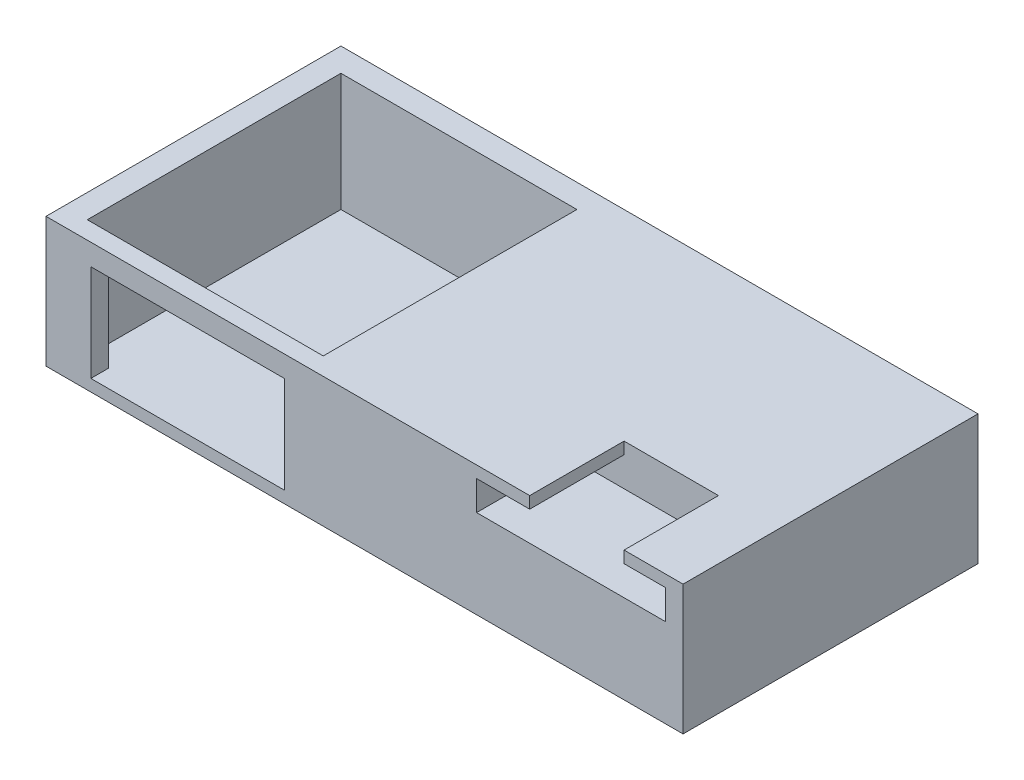
ISO-10303-21;
HEADER;
FILE_DESCRIPTION(('STEP AP214'),'2;1');
FILE_NAME('part.step','',(''),(''),'','','');
FILE_SCHEMA(('AUTOMOTIVE_DESIGN { 1 0 10303 214 1 1 1 1 }'));
ENDSEC;
DATA;
#1=APPLICATION_CONTEXT('core data for automotive mechanical design processes');
#2=APPLICATION_PROTOCOL_DEFINITION('international standard','automotive_design',2000,#1);
#3=PRODUCT_CONTEXT('',#1,'mechanical');
#4=PRODUCT('Part','Part','',(#3));
#5=PRODUCT_RELATED_PRODUCT_CATEGORY('part','',(#4));
#6=PRODUCT_DEFINITION_FORMATION('','',#4);
#7=PRODUCT_DEFINITION_CONTEXT('part definition',#1,'design');
#8=PRODUCT_DEFINITION('design','',#6,#7);
#9=PRODUCT_DEFINITION_SHAPE('','',#8);
#10=(LENGTH_UNIT() NAMED_UNIT(*) SI_UNIT(.MILLI.,.METRE.));
#11=(NAMED_UNIT(*) PLANE_ANGLE_UNIT() SI_UNIT($,.RADIAN.));
#12=(NAMED_UNIT(*) SI_UNIT($,.STERADIAN.) SOLID_ANGLE_UNIT());
#13=UNCERTAINTY_MEASURE_WITH_UNIT(LENGTH_MEASURE(1.E-05),#10,'distance_accuracy_value','');
#14=(GEOMETRIC_REPRESENTATION_CONTEXT(3) GLOBAL_UNCERTAINTY_ASSIGNED_CONTEXT((#13)) GLOBAL_UNIT_ASSIGNED_CONTEXT((#10,
#11,#12)) REPRESENTATION_CONTEXT('',''));
#15=CARTESIAN_POINT('',(0.,0.,0.));
#16=DIRECTION('',(0.,0.,1.));
#17=DIRECTION('',(1.,0.,0.));
#18=AXIS2_PLACEMENT_3D('',#15,#16,#17);
#19=CARTESIAN_POINT('',(22.,7.5,-0.500000000000002));
#20=DIRECTION('',(1.,0.,0.));
#21=DIRECTION('',(0.,0.,-1.));
#22=AXIS2_PLACEMENT_3D('',#19,#20,#21);
#23=PLANE('',#22);
#24=DIRECTION('',(0.,0.,-1.));
#25=VECTOR('',#24,1.);
#26=CARTESIAN_POINT('',(22.,10.,-0.500000000000002));
#27=LINE('',#26,#25);
#28=CARTESIAN_POINT('',(22.,10.,-0.5));
#29=VERTEX_POINT('',#28);
#30=CARTESIAN_POINT('',(21.9999999999999,10.,-8.5));
#31=VERTEX_POINT('',#30);
#32=EDGE_CURVE('E176',#29,#31,#27,.T.);
#33=ORIENTED_EDGE('',*,*,#32,.F.);
#34=DIRECTION('',(0.,1.,0.));
#35=VECTOR('',#34,1.);
#36=CARTESIAN_POINT('',(22.,7.5,-0.500000000000002));
#37=LINE('',#36,#35);
#38=CARTESIAN_POINT('',(22.,11.,-0.500000000000002));
#39=VERTEX_POINT('',#38);
#40=EDGE_CURVE('E250',#29,#39,#37,.T.);
#41=ORIENTED_EDGE('',*,*,#40,.T.);
#42=DIRECTION('',(0.,0.,-1.));
#43=VECTOR('',#42,1.);
#44=CARTESIAN_POINT('',(22.,11.,-0.500000000000002));
#45=LINE('',#44,#43);
#46=CARTESIAN_POINT('',(21.9999999999999,11.,-8.5));
#47=VERTEX_POINT('',#46);
#48=EDGE_CURVE('E224',#39,#47,#45,.T.);
#49=ORIENTED_EDGE('',*,*,#48,.T.);
#50=DIRECTION('',(0.,1.,0.));
#51=VECTOR('',#50,1.);
#52=CARTESIAN_POINT('',(21.9999999999999,7.5,-8.5));
#53=LINE('',#52,#51);
#54=EDGE_CURVE('E242',#31,#47,#53,.T.);
#55=ORIENTED_EDGE('',*,*,#54,.F.);
#56=EDGE_LOOP('',(#33,#41,#49,#55));
#57=FACE_BOUND('',#56,.T.);
#58=ADVANCED_FACE('F36',(#57),#23,.F.);
#59=CARTESIAN_POINT('',(13.9999999999999,7.5,-8.5));
#60=DIRECTION('',(-1.,0.,0.));
#61=DIRECTION('',(0.,0.,1.));
#62=AXIS2_PLACEMENT_3D('',#59,#60,#61);
#63=PLANE('',#62);
#64=DIRECTION('',(0.,0.,1.));
#65=VECTOR('',#64,1.);
#66=CARTESIAN_POINT('',(13.9999999999999,10.,-8.5));
#67=LINE('',#66,#65);
#68=CARTESIAN_POINT('',(13.9999999999999,10.,-8.49999999999999));
#69=VERTEX_POINT('',#68);
#70=CARTESIAN_POINT('',(13.9999999999999,10.,-0.5));
#71=VERTEX_POINT('',#70);
#72=EDGE_CURVE('E195',#69,#71,#67,.T.);
#73=ORIENTED_EDGE('',*,*,#72,.F.);
#74=DIRECTION('',(0.,1.,0.));
#75=VECTOR('',#74,1.);
#76=CARTESIAN_POINT('',(13.9999999999999,7.5,-8.5));
#77=LINE('',#76,#75);
#78=CARTESIAN_POINT('',(13.9999999999999,11.,-8.5));
#79=VERTEX_POINT('',#78);
#80=EDGE_CURVE('E255',#69,#79,#77,.T.);
#81=ORIENTED_EDGE('',*,*,#80,.T.);
#82=DIRECTION('',(0.,0.,1.));
#83=VECTOR('',#82,1.);
#84=CARTESIAN_POINT('',(13.9999999999999,11.,-8.5));
#85=LINE('',#84,#83);
#86=CARTESIAN_POINT('',(13.9999999999999,11.,-0.5));
#87=VERTEX_POINT('',#86);
#88=EDGE_CURVE('E240',#79,#87,#85,.T.);
#89=ORIENTED_EDGE('',*,*,#88,.T.);
#90=DIRECTION('',(0.,1.,0.));
#91=VECTOR('',#90,1.);
#92=CARTESIAN_POINT('',(13.9999999999999,7.5,-0.5));
#93=LINE('',#92,#91);
#94=EDGE_CURVE('E253',#71,#87,#93,.T.);
#95=ORIENTED_EDGE('',*,*,#94,.F.);
#96=EDGE_LOOP('',(#73,#81,#89,#95));
#97=FACE_BOUND('',#96,.T.);
#98=ADVANCED_FACE('F348',(#97),#63,.F.);
#99=CARTESIAN_POINT('',(-27.,11.,-0.5));
#100=DIRECTION('',(0.,0.,-1.));
#101=DIRECTION('',(-1.,0.,0.));
#102=AXIS2_PLACEMENT_3D('',#99,#100,#101);
#103=PLANE('',#102);
#104=DIRECTION('',(1.,0.,0.));
#105=VECTOR('',#104,1.);
#106=CARTESIAN_POINT('',(13.9999999999999,7.5,-0.5));
#107=LINE('',#106,#105);
#108=CARTESIAN_POINT('',(9.49999999999995,7.5,-0.5));
#109=VERTEX_POINT('',#108);
#110=CARTESIAN_POINT('',(25.4999999999999,7.5,-0.5));
#111=VERTEX_POINT('',#110);
#112=EDGE_CURVE('E239',#109,#111,#107,.T.);
#113=ORIENTED_EDGE('',*,*,#112,.F.);
#114=DIRECTION('',(0.,-1.,0.));
#115=VECTOR('',#114,1.);
#116=CARTESIAN_POINT('',(9.49999999999995,10.,-0.5));
#117=LINE('',#116,#115);
#118=CARTESIAN_POINT('',(9.49999999999995,10.,-0.5));
#119=VERTEX_POINT('',#118);
#120=EDGE_CURVE('E179',#119,#109,#117,.T.);
#121=ORIENTED_EDGE('',*,*,#120,.F.);
#122=DIRECTION('',(1.,0.,0.));
#123=VECTOR('',#122,1.);
#124=CARTESIAN_POINT('',(9.49999999999995,10.,-0.5));
#125=LINE('',#124,#123);
#126=EDGE_CURVE('E189',#119,#71,#125,.T.);
#127=ORIENTED_EDGE('',*,*,#126,.T.);
#128=ORIENTED_EDGE('',*,*,#94,.T.);
#129=DIRECTION('',(1.,0.,0.));
#130=VECTOR('',#129,1.);
#131=CARTESIAN_POINT('',(-27.,11.,-0.5));
#132=LINE('',#131,#130);
#133=CARTESIAN_POINT('',(-27.,11.,-0.5));
#134=VERTEX_POINT('',#133);
#135=EDGE_CURVE('E298',#134,#87,#132,.T.);
#136=ORIENTED_EDGE('',*,*,#135,.F.);
#137=DIRECTION('',(0.,-1.,0.));
#138=VECTOR('',#137,1.);
#139=CARTESIAN_POINT('',(-27.,11.,-0.5));
#140=LINE('',#139,#138);
#141=CARTESIAN_POINT('',(-27.,0.,-0.5));
#142=VERTEX_POINT('',#141);
#143=EDGE_CURVE('E44',#134,#142,#140,.T.);
#144=ORIENTED_EDGE('',*,*,#143,.T.);
#145=DIRECTION('',(1.,0.,0.));
#146=VECTOR('',#145,1.);
#147=CARTESIAN_POINT('',(-27.,0.,-0.5));
#148=LINE('',#147,#146);
#149=CARTESIAN_POINT('',(27.,0.,-0.5));
#150=VERTEX_POINT('',#149);
#151=EDGE_CURVE('E308',#142,#150,#148,.T.);
#152=ORIENTED_EDGE('',*,*,#151,.T.);
#153=DIRECTION('',(0.,-1.,0.));
#154=VECTOR('',#153,1.);
#155=CARTESIAN_POINT('',(27.,11.,-0.5));
#156=LINE('',#155,#154);
#157=CARTESIAN_POINT('',(27.,11.,-0.5));
#158=VERTEX_POINT('',#157);
#159=EDGE_CURVE('E313',#158,#150,#156,.T.);
#160=ORIENTED_EDGE('',*,*,#159,.F.);
#161=EDGE_CURVE('E297',#39,#158,#132,.T.);
#162=ORIENTED_EDGE('',*,*,#161,.F.);
#163=ORIENTED_EDGE('',*,*,#40,.F.);
#164=CARTESIAN_POINT('',(25.4999999999999,10.,-0.5));
#165=VERTEX_POINT('',#164);
#166=EDGE_CURVE('E205',#29,#165,#125,.T.);
#167=ORIENTED_EDGE('',*,*,#166,.T.);
#168=DIRECTION('',(0.,-1.,0.));
#169=VECTOR('',#168,1.);
#170=CARTESIAN_POINT('',(25.4999999999999,10.,-0.5));
#171=LINE('',#170,#169);
#172=EDGE_CURVE('E187',#165,#111,#171,.T.);
#173=ORIENTED_EDGE('',*,*,#172,.T.);
#174=EDGE_LOOP('',(#113,#121,#127,#128,#136,#144,#152,#160,#162,#163,#167,#173));
#175=FACE_BOUND('',#174,.T.);
#176=DIRECTION('',(0.,1.,0.));
#177=VECTOR('',#176,1.);
#178=CARTESIAN_POINT('',(-23.2,0.,-0.5));
#179=LINE('',#178,#177);
#180=CARTESIAN_POINT('',(-23.2,0.999999999999999,-0.5));
#181=VERTEX_POINT('',#180);
#182=CARTESIAN_POINT('',(-23.2,9.2,-0.5));
#183=VERTEX_POINT('',#182);
#184=EDGE_CURVE('E59',#181,#183,#179,.T.);
#185=ORIENTED_EDGE('',*,*,#184,.T.);
#186=DIRECTION('',(1.,0.,0.));
#187=VECTOR('',#186,1.);
#188=CARTESIAN_POINT('',(0.,9.2,-0.5));
#189=LINE('',#188,#187);
#190=CARTESIAN_POINT('',(-6.80000000000005,9.2,-0.5));
#191=VERTEX_POINT('',#190);
#192=EDGE_CURVE('E211',#183,#191,#189,.T.);
#193=ORIENTED_EDGE('',*,*,#192,.T.);
#194=DIRECTION('',(0.,-1.,0.));
#195=VECTOR('',#194,1.);
#196=CARTESIAN_POINT('',(-6.80000000000004,0.,-0.5));
#197=LINE('',#196,#195);
#198=CARTESIAN_POINT('',(-6.80000000000005,0.999999999999999,-0.5));
#199=VERTEX_POINT('',#198);
#200=EDGE_CURVE('E216',#191,#199,#197,.T.);
#201=ORIENTED_EDGE('',*,*,#200,.T.);
#202=DIRECTION('',(-1.,0.,0.));
#203=VECTOR('',#202,1.);
#204=CARTESIAN_POINT('',(0.,0.999999999999999,-0.5));
#205=LINE('',#204,#203);
#206=EDGE_CURVE('E221',#199,#181,#205,.T.);
#207=ORIENTED_EDGE('',*,*,#206,.T.);
#208=EDGE_LOOP('',(#185,#193,#201,#207));
#209=FACE_BOUND('',#208,.T.);
#210=ADVANCED_FACE('F320',(#175,#209),#103,.F.);
#211=CARTESIAN_POINT('',(0.,0.999999999999999,-2.00000000000003));
#212=DIRECTION('',(0.,0.,1.));
#213=DIRECTION('',(1.,0.,0.));
#214=AXIS2_PLACEMENT_3D('',#211,#212,#213);
#215=PLANE('',#214);
#216=DIRECTION('',(0.,-1.,0.));
#217=VECTOR('',#216,1.);
#218=CARTESIAN_POINT('',(-23.2,0.,-2.00000000000003));
#219=LINE('',#218,#217);
#220=CARTESIAN_POINT('',(-23.2,9.2,-2.00000000000003));
#221=VERTEX_POINT('',#220);
#222=CARTESIAN_POINT('',(-23.2,0.999999999999999,-2.00000000000003));
#223=VERTEX_POINT('',#222);
#224=EDGE_CURVE('E210',#221,#223,#219,.T.);
#225=ORIENTED_EDGE('',*,*,#224,.T.);
#226=DIRECTION('',(1.,0.,0.));
#227=VECTOR('',#226,1.);
#228=CARTESIAN_POINT('',(0.,0.999999999999999,-2.00000000000003));
#229=LINE('',#228,#227);
#230=CARTESIAN_POINT('',(-25.,0.999999999999999,-2.00000000000003));
#231=VERTEX_POINT('',#230);
#232=EDGE_CURVE('E268',#231,#223,#229,.T.);
#233=ORIENTED_EDGE('',*,*,#232,.F.);
#234=DIRECTION('',(0.,1.,0.));
#235=VECTOR('',#234,1.);
#236=CARTESIAN_POINT('',(-25.,0.999999999999999,-2.00000000000003));
#237=LINE('',#236,#235);
#238=CARTESIAN_POINT('',(-25.,11.,-2.00000000000003));
#239=VERTEX_POINT('',#238);
#240=EDGE_CURVE('E285',#231,#239,#237,.T.);
#241=ORIENTED_EDGE('',*,*,#240,.T.);
#242=DIRECTION('',(1.,0.,0.));
#243=VECTOR('',#242,1.);
#244=CARTESIAN_POINT('',(0.,11.,-2.00000000000003));
#245=LINE('',#244,#243);
#246=CARTESIAN_POINT('',(-5.00000000000005,11.,-2.00000000000003));
#247=VERTEX_POINT('',#246);
#248=EDGE_CURVE('E262',#239,#247,#245,.T.);
#249=ORIENTED_EDGE('',*,*,#248,.T.);
#250=DIRECTION('',(0.,1.,0.));
#251=VECTOR('',#250,1.);
#252=CARTESIAN_POINT('',(-5.00000000000005,0.999999999999999,-2.00000000000003));
#253=LINE('',#252,#251);
#254=CARTESIAN_POINT('',(-5.00000000000005,0.999999999999999,-2.00000000000003));
#255=VERTEX_POINT('',#254);
#256=EDGE_CURVE('E282',#255,#247,#253,.T.);
#257=ORIENTED_EDGE('',*,*,#256,.F.);
#258=CARTESIAN_POINT('',(-6.80000000000005,0.999999999999999,-2.00000000000003));
#259=VERTEX_POINT('',#258);
#260=EDGE_CURVE('E267',#259,#255,#229,.T.);
#261=ORIENTED_EDGE('',*,*,#260,.F.);
#262=DIRECTION('',(0.,1.,0.));
#263=VECTOR('',#262,1.);
#264=CARTESIAN_POINT('',(-6.80000000000004,0.,-2.00000000000003));
#265=LINE('',#264,#263);
#266=CARTESIAN_POINT('',(-6.80000000000005,9.2,-2.00000000000003));
#267=VERTEX_POINT('',#266);
#268=EDGE_CURVE('E214',#259,#267,#265,.T.);
#269=ORIENTED_EDGE('',*,*,#268,.T.);
#270=DIRECTION('',(-1.,0.,0.));
#271=VECTOR('',#270,1.);
#272=CARTESIAN_POINT('',(0.,9.2,-2.00000000000003));
#273=LINE('',#272,#271);
#274=EDGE_CURVE('E226',#267,#221,#273,.T.);
#275=ORIENTED_EDGE('',*,*,#274,.T.);
#276=EDGE_LOOP('',(#225,#233,#241,#249,#257,#261,#269,#275));
#277=FACE_BOUND('',#276,.T.);
#278=ADVANCED_FACE('F388',(#277),#215,.F.);
#279=CARTESIAN_POINT('',(0.,11.,0.));
#280=DIRECTION('',(0.,1.,0.));
#281=DIRECTION('',(0.,0.,1.));
#282=AXIS2_PLACEMENT_3D('',#279,#280,#281);
#283=PLANE('',#282);
#284=ORIENTED_EDGE('',*,*,#48,.F.);
#285=ORIENTED_EDGE('',*,*,#161,.T.);
#286=DIRECTION('',(0.,0.,-1.));
#287=VECTOR('',#286,1.);
#288=CARTESIAN_POINT('',(27.,11.,-0.5));
#289=LINE('',#288,#287);
#290=CARTESIAN_POINT('',(27.,11.,-25.5));
#291=VERTEX_POINT('',#290);
#292=EDGE_CURVE('E301',#158,#291,#289,.T.);
#293=ORIENTED_EDGE('',*,*,#292,.T.);
#294=DIRECTION('',(-1.,0.,0.));
#295=VECTOR('',#294,1.);
#296=CARTESIAN_POINT('',(27.,11.,-25.5));
#297=LINE('',#296,#295);
#298=CARTESIAN_POINT('',(-27.,11.,-25.5));
#299=VERTEX_POINT('',#298);
#300=EDGE_CURVE('E291',#291,#299,#297,.T.);
#301=ORIENTED_EDGE('',*,*,#300,.T.);
#302=DIRECTION('',(0.,0.,1.));
#303=VECTOR('',#302,1.);
#304=CARTESIAN_POINT('',(-27.,11.,-25.5));
#305=LINE('',#304,#303);
#306=EDGE_CURVE('E294',#299,#134,#305,.T.);
#307=ORIENTED_EDGE('',*,*,#306,.T.);
#308=ORIENTED_EDGE('',*,*,#135,.T.);
#309=ORIENTED_EDGE('',*,*,#88,.F.);
#310=DIRECTION('',(-1.,0.,0.));
#311=VECTOR('',#310,1.);
#312=CARTESIAN_POINT('',(21.9999999999999,11.,-8.5));
#313=LINE('',#312,#311);
#314=EDGE_CURVE('E245',#47,#79,#313,.T.);
#315=ORIENTED_EDGE('',*,*,#314,.F.);
#316=EDGE_LOOP('',(#284,#285,#293,#301,#307,#308,#309,#315));
#317=FACE_BOUND('',#316,.T.);
#318=DIRECTION('',(1.,0.,0.));
#319=VECTOR('',#318,1.);
#320=CARTESIAN_POINT('',(0.,11.,-23.5));
#321=LINE('',#320,#319);
#322=CARTESIAN_POINT('',(-25.,11.,-23.5));
#323=VERTEX_POINT('',#322);
#324=CARTESIAN_POINT('',(-5.00000000000005,11.,-23.5));
#325=VERTEX_POINT('',#324);
#326=EDGE_CURVE('E274',#323,#325,#321,.T.);
#327=ORIENTED_EDGE('',*,*,#326,.T.);
#328=DIRECTION('',(0.,0.,1.));
#329=VECTOR('',#328,1.);
#330=CARTESIAN_POINT('',(-5.00000000000005,11.,0.));
#331=LINE('',#330,#329);
#332=EDGE_CURVE('E252',#325,#247,#331,.T.);
#333=ORIENTED_EDGE('',*,*,#332,.T.);
#334=ORIENTED_EDGE('',*,*,#248,.F.);
#335=DIRECTION('',(0.,0.,1.));
#336=VECTOR('',#335,1.);
#337=CARTESIAN_POINT('',(-25.,11.,0.));
#338=LINE('',#337,#336);
#339=EDGE_CURVE('E277',#323,#239,#338,.T.);
#340=ORIENTED_EDGE('',*,*,#339,.F.);
#341=EDGE_LOOP('',(#327,#333,#334,#340));
#342=FACE_BOUND('',#341,.T.);
#343=ADVANCED_FACE('F337',(#317,#342),#283,.T.);
#344=CARTESIAN_POINT('',(27.,11.,-25.5));
#345=DIRECTION('',(0.,0.,1.));
#346=DIRECTION('',(1.,0.,0.));
#347=AXIS2_PLACEMENT_3D('',#344,#345,#346);
#348=PLANE('',#347);
#349=DIRECTION('',(-1.,0.,0.));
#350=VECTOR('',#349,1.);
#351=CARTESIAN_POINT('',(27.,0.,-25.5));
#352=LINE('',#351,#350);
#353=CARTESIAN_POINT('',(27.,0.,-25.5));
#354=VERTEX_POINT('',#353);
#355=CARTESIAN_POINT('',(-27.,0.,-25.5));
#356=VERTEX_POINT('',#355);
#357=EDGE_CURVE('E284',#354,#356,#352,.T.);
#358=ORIENTED_EDGE('',*,*,#357,.T.);
#359=DIRECTION('',(0.,-1.,0.));
#360=VECTOR('',#359,1.);
#361=CARTESIAN_POINT('',(-27.,11.,-25.5));
#362=LINE('',#361,#360);
#363=EDGE_CURVE('E11',#299,#356,#362,.T.);
#364=ORIENTED_EDGE('',*,*,#363,.F.);
#365=ORIENTED_EDGE('',*,*,#300,.F.);
#366=DIRECTION('',(0.,-1.,0.));
#367=VECTOR('',#366,1.);
#368=CARTESIAN_POINT('',(27.,11.,-25.5));
#369=LINE('',#368,#367);
#370=EDGE_CURVE('E303',#291,#354,#369,.T.);
#371=ORIENTED_EDGE('',*,*,#370,.T.);
#372=EDGE_LOOP('',(#358,#364,#365,#371));
#373=FACE_BOUND('',#372,.T.);
#374=ADVANCED_FACE('F38',(#373),#348,.F.);
#375=CARTESIAN_POINT('',(-27.,11.,-25.5));
#376=DIRECTION('',(1.,0.,0.));
#377=DIRECTION('',(0.,0.,-1.));
#378=AXIS2_PLACEMENT_3D('',#375,#376,#377);
#379=PLANE('',#378);
#380=DIRECTION('',(0.,0.,1.));
#381=VECTOR('',#380,1.);
#382=CARTESIAN_POINT('',(-27.,0.,-25.5));
#383=LINE('',#382,#381);
#384=EDGE_CURVE('E306',#356,#142,#383,.T.);
#385=ORIENTED_EDGE('',*,*,#384,.T.);
#386=ORIENTED_EDGE('',*,*,#143,.F.);
#387=ORIENTED_EDGE('',*,*,#306,.F.);
#388=ORIENTED_EDGE('',*,*,#363,.T.);
#389=EDGE_LOOP('',(#385,#386,#387,#388));
#390=FACE_BOUND('',#389,.T.);
#391=ADVANCED_FACE('F409',(#390),#379,.F.);
#392=CARTESIAN_POINT('',(27.,11.,-0.5));
#393=DIRECTION('',(-1.,0.,0.));
#394=DIRECTION('',(0.,0.,1.));
#395=AXIS2_PLACEMENT_3D('',#392,#393,#394);
#396=PLANE('',#395);
#397=DIRECTION('',(0.,0.,-1.));
#398=VECTOR('',#397,1.);
#399=CARTESIAN_POINT('',(27.,0.,-0.5));
#400=LINE('',#399,#398);
#401=EDGE_CURVE('E295',#150,#354,#400,.T.);
#402=ORIENTED_EDGE('',*,*,#401,.T.);
#403=ORIENTED_EDGE('',*,*,#370,.F.);
#404=ORIENTED_EDGE('',*,*,#292,.F.);
#405=ORIENTED_EDGE('',*,*,#159,.T.);
#406=EDGE_LOOP('',(#402,#403,#404,#405));
#407=FACE_BOUND('',#406,.T.);
#408=ADVANCED_FACE('F330',(#407),#396,.F.);
#409=CARTESIAN_POINT('',(0.,0.,0.));
#410=DIRECTION('',(0.,1.,0.));
#411=DIRECTION('',(0.,0.,1.));
#412=AXIS2_PLACEMENT_3D('',#409,#410,#411);
#413=PLANE('',#412);
#414=ORIENTED_EDGE('',*,*,#357,.F.);
#415=ORIENTED_EDGE('',*,*,#401,.F.);
#416=ORIENTED_EDGE('',*,*,#151,.F.);
#417=ORIENTED_EDGE('',*,*,#384,.F.);
#418=EDGE_LOOP('',(#414,#415,#416,#417));
#419=FACE_BOUND('',#418,.T.);
#420=ADVANCED_FACE('F327',(#419),#413,.F.);
#421=CARTESIAN_POINT('',(-5.00000000000005,0.999999999999999,0.));
#422=DIRECTION('',(-1.,0.,0.));
#423=DIRECTION('',(0.,0.,1.));
#424=AXIS2_PLACEMENT_3D('',#421,#422,#423);
#425=PLANE('',#424);
#426=ORIENTED_EDGE('',*,*,#332,.F.);
#427=DIRECTION('',(0.,1.,0.));
#428=VECTOR('',#427,1.);
#429=CARTESIAN_POINT('',(-5.00000000000005,0.999999999999999,-23.5));
#430=LINE('',#429,#428);
#431=CARTESIAN_POINT('',(-5.00000000000005,0.999999999999999,-23.5));
#432=VERTEX_POINT('',#431);
#433=EDGE_CURVE('E271',#432,#325,#430,.T.);
#434=ORIENTED_EDGE('',*,*,#433,.F.);
#435=DIRECTION('',(0.,0.,1.));
#436=VECTOR('',#435,1.);
#437=CARTESIAN_POINT('',(-5.00000000000005,0.999999999999999,0.));
#438=LINE('',#437,#436);
#439=EDGE_CURVE('E258',#432,#255,#438,.T.);
#440=ORIENTED_EDGE('',*,*,#439,.T.);
#441=ORIENTED_EDGE('',*,*,#256,.T.);
#442=EDGE_LOOP('',(#426,#434,#440,#441));
#443=FACE_BOUND('',#442,.T.);
#444=ADVANCED_FACE('F395',(#443),#425,.T.);
#445=CARTESIAN_POINT('',(-25.,0.999999999999999,0.));
#446=DIRECTION('',(-1.,0.,0.));
#447=DIRECTION('',(0.,0.,1.));
#448=AXIS2_PLACEMENT_3D('',#445,#446,#447);
#449=PLANE('',#448);
#450=ORIENTED_EDGE('',*,*,#339,.T.);
#451=ORIENTED_EDGE('',*,*,#240,.F.);
#452=DIRECTION('',(0.,0.,1.));
#453=VECTOR('',#452,1.);
#454=CARTESIAN_POINT('',(-25.,0.999999999999999,0.));
#455=LINE('',#454,#453);
#456=CARTESIAN_POINT('',(-25.,0.999999999999999,-23.5));
#457=VERTEX_POINT('',#456);
#458=EDGE_CURVE('E264',#457,#231,#455,.T.);
#459=ORIENTED_EDGE('',*,*,#458,.F.);
#460=DIRECTION('',(0.,1.,0.));
#461=VECTOR('',#460,1.);
#462=CARTESIAN_POINT('',(-25.,0.999999999999999,-23.5));
#463=LINE('',#462,#461);
#464=EDGE_CURVE('E287',#457,#323,#463,.T.);
#465=ORIENTED_EDGE('',*,*,#464,.T.);
#466=EDGE_LOOP('',(#450,#451,#459,#465));
#467=FACE_BOUND('',#466,.T.);
#468=ADVANCED_FACE('F392',(#467),#449,.F.);
#469=CARTESIAN_POINT('',(0.,0.999999999999999,-23.5));
#470=DIRECTION('',(0.,0.,1.));
#471=DIRECTION('',(1.,0.,0.));
#472=AXIS2_PLACEMENT_3D('',#469,#470,#471);
#473=PLANE('',#472);
#474=ORIENTED_EDGE('',*,*,#326,.F.);
#475=ORIENTED_EDGE('',*,*,#464,.F.);
#476=DIRECTION('',(1.,0.,0.));
#477=VECTOR('',#476,1.);
#478=CARTESIAN_POINT('',(0.,0.999999999999999,-23.5));
#479=LINE('',#478,#477);
#480=EDGE_CURVE('E261',#457,#432,#479,.T.);
#481=ORIENTED_EDGE('',*,*,#480,.T.);
#482=ORIENTED_EDGE('',*,*,#433,.T.);
#483=EDGE_LOOP('',(#474,#475,#481,#482));
#484=FACE_BOUND('',#483,.T.);
#485=ADVANCED_FACE('F386',(#484),#473,.T.);
#486=CARTESIAN_POINT('',(0.,0.999999999999999,0.));
#487=DIRECTION('',(0.,1.,0.));
#488=DIRECTION('',(0.,0.,1.));
#489=AXIS2_PLACEMENT_3D('',#486,#487,#488);
#490=PLANE('',#489);
#491=ORIENTED_EDGE('',*,*,#439,.F.);
#492=ORIENTED_EDGE('',*,*,#480,.F.);
#493=ORIENTED_EDGE('',*,*,#458,.T.);
#494=ORIENTED_EDGE('',*,*,#232,.T.);
#495=DIRECTION('',(0.,0.,1.));
#496=VECTOR('',#495,1.);
#497=CARTESIAN_POINT('',(-23.2,0.999999999999999,-25.501));
#498=LINE('',#497,#496);
#499=EDGE_CURVE('E227',#223,#181,#498,.T.);
#500=ORIENTED_EDGE('',*,*,#499,.T.);
#501=ORIENTED_EDGE('',*,*,#206,.F.);
#502=DIRECTION('',(0.,0.,1.));
#503=VECTOR('',#502,1.);
#504=CARTESIAN_POINT('',(-6.80000000000005,0.999999999999999,-25.501));
#505=LINE('',#504,#503);
#506=EDGE_CURVE('E219',#259,#199,#505,.T.);
#507=ORIENTED_EDGE('',*,*,#506,.F.);
#508=ORIENTED_EDGE('',*,*,#260,.T.);
#509=EDGE_LOOP('',(#491,#492,#493,#494,#500,#501,#507,#508));
#510=FACE_BOUND('',#509,.T.);
#511=ADVANCED_FACE('F374',(#510),#490,.T.);
#512=CARTESIAN_POINT('',(21.9999999999999,7.5,-8.5));
#513=DIRECTION('',(0.,0.,-1.));
#514=DIRECTION('',(-1.,0.,0.));
#515=AXIS2_PLACEMENT_3D('',#512,#513,#514);
#516=PLANE('',#515);
#517=DIRECTION('',(-1.,0.,0.));
#518=VECTOR('',#517,1.);
#519=CARTESIAN_POINT('',(21.9999999999999,7.5,-8.5));
#520=LINE('',#519,#518);
#521=CARTESIAN_POINT('',(25.4999999999999,7.5,-8.5));
#522=VERTEX_POINT('',#521);
#523=CARTESIAN_POINT('',(9.49999999999995,7.5,-8.49999999999999));
#524=VERTEX_POINT('',#523);
#525=EDGE_CURVE('E193',#522,#524,#520,.T.);
#526=ORIENTED_EDGE('',*,*,#525,.F.);
#527=DIRECTION('',(0.,-1.,0.));
#528=VECTOR('',#527,1.);
#529=CARTESIAN_POINT('',(25.4999999999999,10.,-8.5));
#530=LINE('',#529,#528);
#531=CARTESIAN_POINT('',(25.4999999999999,10.,-8.5));
#532=VERTEX_POINT('',#531);
#533=EDGE_CURVE('E185',#532,#522,#530,.T.);
#534=ORIENTED_EDGE('',*,*,#533,.F.);
#535=DIRECTION('',(1.,0.,0.));
#536=VECTOR('',#535,1.);
#537=CARTESIAN_POINT('',(9.49999999999995,10.,-8.49999999999999));
#538=LINE('',#537,#536);
#539=EDGE_CURVE('E51',#31,#532,#538,.T.);
#540=ORIENTED_EDGE('',*,*,#539,.F.);
#541=ORIENTED_EDGE('',*,*,#54,.T.);
#542=ORIENTED_EDGE('',*,*,#314,.T.);
#543=ORIENTED_EDGE('',*,*,#80,.F.);
#544=CARTESIAN_POINT('',(9.49999999999995,10.,-8.5));
#545=VERTEX_POINT('',#544);
#546=EDGE_CURVE('E178',#545,#69,#538,.T.);
#547=ORIENTED_EDGE('',*,*,#546,.F.);
#548=DIRECTION('',(0.,-1.,0.));
#549=VECTOR('',#548,1.);
#550=CARTESIAN_POINT('',(9.49999999999995,10.,-8.49999999999999));
#551=LINE('',#550,#549);
#552=EDGE_CURVE('E200',#545,#524,#551,.T.);
#553=ORIENTED_EDGE('',*,*,#552,.T.);
#554=EDGE_LOOP('',(#526,#534,#540,#541,#542,#543,#547,#553));
#555=FACE_BOUND('',#554,.T.);
#556=ADVANCED_FACE('F191',(#555),#516,.F.);
#557=CARTESIAN_POINT('',(0.,7.5,0.));
#558=DIRECTION('',(0.,1.,0.));
#559=DIRECTION('',(0.,0.,1.));
#560=AXIS2_PLACEMENT_3D('',#557,#558,#559);
#561=PLANE('',#560);
#562=ORIENTED_EDGE('',*,*,#112,.T.);
#563=DIRECTION('',(0.,0.,1.));
#564=VECTOR('',#563,1.);
#565=CARTESIAN_POINT('',(25.4999999999999,7.5,-24.6941347407017));
#566=LINE('',#565,#564);
#567=EDGE_CURVE('E207',#522,#111,#566,.T.);
#568=ORIENTED_EDGE('',*,*,#567,.F.);
#569=ORIENTED_EDGE('',*,*,#525,.T.);
#570=DIRECTION('',(0.,0.,1.));
#571=VECTOR('',#570,1.);
#572=CARTESIAN_POINT('',(9.49999999999995,7.5,-24.6941347407017));
#573=LINE('',#572,#571);
#574=EDGE_CURVE('E201',#524,#109,#573,.T.);
#575=ORIENTED_EDGE('',*,*,#574,.T.);
#576=EDGE_LOOP('',(#562,#568,#569,#575));
#577=FACE_BOUND('',#576,.T.);
#578=ADVANCED_FACE('F364',(#577),#561,.T.);
#579=CARTESIAN_POINT('',(-23.2,0.,-25.501));
#580=DIRECTION('',(1.,0.,0.));
#581=DIRECTION('',(0.,0.,-1.));
#582=AXIS2_PLACEMENT_3D('',#579,#580,#581);
#583=PLANE('',#582);
#584=DIRECTION('',(0.,0.,1.));
#585=VECTOR('',#584,1.);
#586=CARTESIAN_POINT('',(-23.2,9.2,-25.501));
#587=LINE('',#586,#585);
#588=EDGE_CURVE('E215',#221,#183,#587,.T.);
#589=ORIENTED_EDGE('',*,*,#588,.T.);
#590=ORIENTED_EDGE('',*,*,#184,.F.);
#591=ORIENTED_EDGE('',*,*,#499,.F.);
#592=ORIENTED_EDGE('',*,*,#224,.F.);
#593=EDGE_LOOP('',(#589,#590,#591,#592));
#594=FACE_BOUND('',#593,.T.);
#595=ADVANCED_FACE('F366',(#594),#583,.T.);
#596=CARTESIAN_POINT('',(0.,9.2,-25.501));
#597=DIRECTION('',(0.,-1.,0.));
#598=DIRECTION('',(1.,0.,0.));
#599=AXIS2_PLACEMENT_3D('',#596,#597,#598);
#600=PLANE('',#599);
#601=DIRECTION('',(0.,0.,1.));
#602=VECTOR('',#601,1.);
#603=CARTESIAN_POINT('',(-6.80000000000005,9.2,-25.501));
#604=LINE('',#603,#602);
#605=EDGE_CURVE('E220',#267,#191,#604,.T.);
#606=ORIENTED_EDGE('',*,*,#605,.T.);
#607=ORIENTED_EDGE('',*,*,#192,.F.);
#608=ORIENTED_EDGE('',*,*,#588,.F.);
#609=ORIENTED_EDGE('',*,*,#274,.F.);
#610=EDGE_LOOP('',(#606,#607,#608,#609));
#611=FACE_BOUND('',#610,.T.);
#612=ADVANCED_FACE('F372',(#611),#600,.T.);
#613=CARTESIAN_POINT('',(-6.80000000000004,0.,-25.501));
#614=DIRECTION('',(-1.,0.,0.));
#615=DIRECTION('',(0.,-1.,0.));
#616=AXIS2_PLACEMENT_3D('',#613,#614,#615);
#617=PLANE('',#616);
#618=ORIENTED_EDGE('',*,*,#506,.T.);
#619=ORIENTED_EDGE('',*,*,#200,.F.);
#620=ORIENTED_EDGE('',*,*,#605,.F.);
#621=ORIENTED_EDGE('',*,*,#268,.F.);
#622=EDGE_LOOP('',(#618,#619,#620,#621));
#623=FACE_BOUND('',#622,.T.);
#624=ADVANCED_FACE('F486',(#623),#617,.T.);
#625=CARTESIAN_POINT('',(9.49999999999995,10.,-24.6941347407017));
#626=DIRECTION('',(0.,-1.,0.));
#627=DIRECTION('',(0.,0.,-1.));
#628=AXIS2_PLACEMENT_3D('',#625,#626,#627);
#629=PLANE('',#628);
#630=ORIENTED_EDGE('',*,*,#72,.T.);
#631=ORIENTED_EDGE('',*,*,#126,.F.);
#632=DIRECTION('',(0.,0.,1.));
#633=VECTOR('',#632,1.);
#634=CARTESIAN_POINT('',(9.49999999999995,10.,-24.6941347407017));
#635=LINE('',#634,#633);
#636=EDGE_CURVE('E204',#545,#119,#635,.T.);
#637=ORIENTED_EDGE('',*,*,#636,.F.);
#638=ORIENTED_EDGE('',*,*,#546,.T.);
#639=EDGE_LOOP('',(#630,#631,#637,#638));
#640=FACE_BOUND('',#639,.T.);
#641=ADVANCED_FACE('F352',(#640),#629,.T.);
#642=CARTESIAN_POINT('',(9.49999999999995,10.,-24.6941347407017));
#643=DIRECTION('',(-1.,0.,0.));
#644=DIRECTION('',(0.,0.,1.));
#645=AXIS2_PLACEMENT_3D('',#642,#643,#644);
#646=PLANE('',#645);
#647=ORIENTED_EDGE('',*,*,#636,.T.);
#648=ORIENTED_EDGE('',*,*,#120,.T.);
#649=ORIENTED_EDGE('',*,*,#574,.F.);
#650=ORIENTED_EDGE('',*,*,#552,.F.);
#651=EDGE_LOOP('',(#647,#648,#649,#650));
#652=FACE_BOUND('',#651,.T.);
#653=ADVANCED_FACE('F361',(#652),#646,.F.);
#654=ORIENTED_EDGE('',*,*,#32,.T.);
#655=ORIENTED_EDGE('',*,*,#539,.T.);
#656=DIRECTION('',(0.,0.,1.));
#657=VECTOR('',#656,1.);
#658=CARTESIAN_POINT('',(25.4999999999999,10.,-24.6941347407017));
#659=LINE('',#658,#657);
#660=EDGE_CURVE('E173',#532,#165,#659,.T.);
#661=ORIENTED_EDGE('',*,*,#660,.T.);
#662=ORIENTED_EDGE('',*,*,#166,.F.);
#663=EDGE_LOOP('',(#654,#655,#661,#662));
#664=FACE_BOUND('',#663,.T.);
#665=ADVANCED_FACE('F172',(#664),#629,.T.);
#666=CARTESIAN_POINT('',(25.4999999999999,10.,-24.6941347407017));
#667=DIRECTION('',(-1.,0.,0.));
#668=DIRECTION('',(0.,0.,1.));
#669=AXIS2_PLACEMENT_3D('',#666,#667,#668);
#670=PLANE('',#669);
#671=ORIENTED_EDGE('',*,*,#533,.T.);
#672=ORIENTED_EDGE('',*,*,#567,.T.);
#673=ORIENTED_EDGE('',*,*,#172,.F.);
#674=ORIENTED_EDGE('',*,*,#660,.F.);
#675=EDGE_LOOP('',(#671,#672,#673,#674));
#676=FACE_BOUND('',#675,.T.);
#677=ADVANCED_FACE('F183',(#676),#670,.T.);
#678=CLOSED_SHELL('',(#58,#98,#210,#278,#343,#374,#391,#408,#420,#444,#468,#485,#511,#556,#578,
#595,#612,#624,#641,#653,#665,#677));
#679=MANIFOLD_SOLID_BREP('B2',#678);
#680=ADVANCED_BREP_SHAPE_REPRESENTATION('',(#18,#679),#14);
#681=SHAPE_DEFINITION_REPRESENTATION(#9,#680);
ENDSEC;
END-ISO-10303-21;
